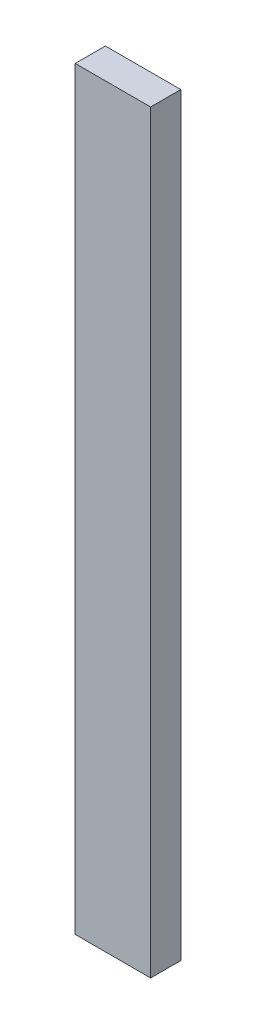
ISO-10303-21;
HEADER;
FILE_DESCRIPTION(('STEP AP214'),'2;1');
FILE_NAME('part.step','',(''),(''),'','','');
FILE_SCHEMA(('AUTOMOTIVE_DESIGN { 1 0 10303 214 1 1 1 1 }'));
ENDSEC;
DATA;
#1=APPLICATION_CONTEXT('core data for automotive mechanical design processes');
#2=APPLICATION_PROTOCOL_DEFINITION('international standard','automotive_design',2000,#1);
#3=PRODUCT_CONTEXT('',#1,'mechanical');
#4=PRODUCT('Part','Part','',(#3));
#5=PRODUCT_RELATED_PRODUCT_CATEGORY('part','',(#4));
#6=PRODUCT_DEFINITION_FORMATION('','',#4);
#7=PRODUCT_DEFINITION_CONTEXT('part definition',#1,'design');
#8=PRODUCT_DEFINITION('design','',#6,#7);
#9=PRODUCT_DEFINITION_SHAPE('','',#8);
#10=(LENGTH_UNIT() NAMED_UNIT(*) SI_UNIT(.MILLI.,.METRE.));
#11=(NAMED_UNIT(*) PLANE_ANGLE_UNIT() SI_UNIT($,.RADIAN.));
#12=(NAMED_UNIT(*) SI_UNIT($,.STERADIAN.) SOLID_ANGLE_UNIT());
#13=UNCERTAINTY_MEASURE_WITH_UNIT(LENGTH_MEASURE(1.E-05),#10,'distance_accuracy_value','');
#14=(GEOMETRIC_REPRESENTATION_CONTEXT(3) GLOBAL_UNCERTAINTY_ASSIGNED_CONTEXT((#13)) GLOBAL_UNIT_ASSIGNED_CONTEXT((#10,
#11,#12)) REPRESENTATION_CONTEXT('',''));
#15=CARTESIAN_POINT('',(0.,0.,0.));
#16=DIRECTION('',(0.,0.,1.));
#17=DIRECTION('',(1.,0.,0.));
#18=AXIS2_PLACEMENT_3D('',#15,#16,#17);
#19=CARTESIAN_POINT('',(2.5,25.,2.));
#20=DIRECTION('',(-1.,0.,0.));
#21=DIRECTION('',(0.,-1.,0.));
#22=AXIS2_PLACEMENT_3D('',#19,#20,#21);
#23=PLANE('',#22);
#24=DIRECTION('',(0.,1.,0.));
#25=VECTOR('',#24,1.);
#26=CARTESIAN_POINT('',(2.5,25.,0.));
#27=LINE('',#26,#25);
#28=CARTESIAN_POINT('',(2.5,-25.,0.));
#29=VERTEX_POINT('',#28);
#30=CARTESIAN_POINT('',(2.5,25.,0.));
#31=VERTEX_POINT('',#30);
#32=EDGE_CURVE('E107',#29,#31,#27,.T.);
#33=ORIENTED_EDGE('',*,*,#32,.T.);
#34=DIRECTION('',(0.,0.,-1.));
#35=VECTOR('',#34,1.);
#36=CARTESIAN_POINT('',(2.5,25.,2.));
#37=LINE('',#36,#35);
#38=CARTESIAN_POINT('',(2.5,25.,2.));
#39=VERTEX_POINT('',#38);
#40=EDGE_CURVE('E11',#39,#31,#37,.T.);
#41=ORIENTED_EDGE('',*,*,#40,.F.);
#42=DIRECTION('',(0.,1.,0.));
#43=VECTOR('',#42,1.);
#44=CARTESIAN_POINT('',(2.5,25.,2.));
#45=LINE('',#44,#43);
#46=CARTESIAN_POINT('',(2.5,-25.,2.));
#47=VERTEX_POINT('',#46);
#48=EDGE_CURVE('E91',#47,#39,#45,.T.);
#49=ORIENTED_EDGE('',*,*,#48,.F.);
#50=DIRECTION('',(0.,0.,-1.));
#51=VECTOR('',#50,1.);
#52=CARTESIAN_POINT('',(2.5,-25.,2.));
#53=LINE('',#52,#51);
#54=EDGE_CURVE('E103',#47,#29,#53,.T.);
#55=ORIENTED_EDGE('',*,*,#54,.T.);
#56=EDGE_LOOP('',(#33,#41,#49,#55));
#57=FACE_BOUND('',#56,.T.);
#58=ADVANCED_FACE('F39',(#57),#23,.F.);
#59=CARTESIAN_POINT('',(-2.5,25.,2.));
#60=DIRECTION('',(0.,-1.,0.));
#61=DIRECTION('',(0.,0.,-1.));
#62=AXIS2_PLACEMENT_3D('',#59,#60,#61);
#63=PLANE('',#62);
#64=DIRECTION('',(-1.,0.,0.));
#65=VECTOR('',#64,1.);
#66=CARTESIAN_POINT('',(-2.5,25.,0.));
#67=LINE('',#66,#65);
#68=CARTESIAN_POINT('',(-2.5,25.,0.));
#69=VERTEX_POINT('',#68);
#70=EDGE_CURVE('E96',#31,#69,#67,.T.);
#71=ORIENTED_EDGE('',*,*,#70,.T.);
#72=DIRECTION('',(0.,0.,-1.));
#73=VECTOR('',#72,1.);
#74=CARTESIAN_POINT('',(-2.5,25.,2.));
#75=LINE('',#74,#73);
#76=CARTESIAN_POINT('',(-2.5,25.,2.));
#77=VERTEX_POINT('',#76);
#78=EDGE_CURVE('E48',#77,#69,#75,.T.);
#79=ORIENTED_EDGE('',*,*,#78,.F.);
#80=DIRECTION('',(-1.,0.,0.));
#81=VECTOR('',#80,1.);
#82=CARTESIAN_POINT('',(-2.5,25.,2.));
#83=LINE('',#82,#81);
#84=EDGE_CURVE('E86',#39,#77,#83,.T.);
#85=ORIENTED_EDGE('',*,*,#84,.F.);
#86=ORIENTED_EDGE('',*,*,#40,.T.);
#87=EDGE_LOOP('',(#71,#79,#85,#86));
#88=FACE_BOUND('',#87,.T.);
#89=ADVANCED_FACE('F95',(#88),#63,.F.);
#90=CARTESIAN_POINT('',(-2.5,25.,2.));
#91=DIRECTION('',(1.,0.,0.));
#92=DIRECTION('',(0.,1.,0.));
#93=AXIS2_PLACEMENT_3D('',#90,#91,#92);
#94=PLANE('',#93);
#95=DIRECTION('',(0.,-1.,0.));
#96=VECTOR('',#95,1.);
#97=CARTESIAN_POINT('',(-2.5,25.,0.));
#98=LINE('',#97,#96);
#99=CARTESIAN_POINT('',(-2.5,-25.,0.));
#100=VERTEX_POINT('',#99);
#101=EDGE_CURVE('E73',#69,#100,#98,.T.);
#102=ORIENTED_EDGE('',*,*,#101,.T.);
#103=DIRECTION('',(0.,0.,-1.));
#104=VECTOR('',#103,1.);
#105=CARTESIAN_POINT('',(-2.5,-25.,2.));
#106=LINE('',#105,#104);
#107=CARTESIAN_POINT('',(-2.5,-25.,2.));
#108=VERTEX_POINT('',#107);
#109=EDGE_CURVE('E98',#108,#100,#106,.T.);
#110=ORIENTED_EDGE('',*,*,#109,.F.);
#111=DIRECTION('',(0.,-1.,0.));
#112=VECTOR('',#111,1.);
#113=CARTESIAN_POINT('',(-2.5,25.,2.));
#114=LINE('',#113,#112);
#115=EDGE_CURVE('E89',#77,#108,#114,.T.);
#116=ORIENTED_EDGE('',*,*,#115,.F.);
#117=ORIENTED_EDGE('',*,*,#78,.T.);
#118=EDGE_LOOP('',(#102,#110,#116,#117));
#119=FACE_BOUND('',#118,.T.);
#120=ADVANCED_FACE('F99',(#119),#94,.F.);
#121=CARTESIAN_POINT('',(-2.5,-25.,2.));
#122=DIRECTION('',(0.,1.,0.));
#123=DIRECTION('',(0.,0.,1.));
#124=AXIS2_PLACEMENT_3D('',#121,#122,#123);
#125=PLANE('',#124);
#126=DIRECTION('',(1.,0.,0.));
#127=VECTOR('',#126,1.);
#128=CARTESIAN_POINT('',(-2.5,-25.,0.));
#129=LINE('',#128,#127);
#130=EDGE_CURVE('E79',#100,#29,#129,.T.);
#131=ORIENTED_EDGE('',*,*,#130,.T.);
#132=ORIENTED_EDGE('',*,*,#54,.F.);
#133=DIRECTION('',(1.,0.,0.));
#134=VECTOR('',#133,1.);
#135=CARTESIAN_POINT('',(-2.5,-25.,2.));
#136=LINE('',#135,#134);
#137=EDGE_CURVE('E56',#108,#47,#136,.T.);
#138=ORIENTED_EDGE('',*,*,#137,.F.);
#139=ORIENTED_EDGE('',*,*,#109,.T.);
#140=EDGE_LOOP('',(#131,#132,#138,#139));
#141=FACE_BOUND('',#140,.T.);
#142=ADVANCED_FACE('F120',(#141),#125,.F.);
#143=CARTESIAN_POINT('',(0.,0.,2.));
#144=DIRECTION('',(0.,0.,1.));
#145=DIRECTION('',(1.,0.,0.));
#146=AXIS2_PLACEMENT_3D('',#143,#144,#145);
#147=PLANE('',#146);
#148=ORIENTED_EDGE('',*,*,#48,.T.);
#149=ORIENTED_EDGE('',*,*,#84,.T.);
#150=ORIENTED_EDGE('',*,*,#115,.T.);
#151=ORIENTED_EDGE('',*,*,#137,.T.);
#152=EDGE_LOOP('',(#148,#149,#150,#151));
#153=FACE_BOUND('',#152,.T.);
#154=ADVANCED_FACE('F87',(#153),#147,.T.);
#155=CARTESIAN_POINT('',(0.,0.,0.));
#156=DIRECTION('',(0.,0.,1.));
#157=DIRECTION('',(1.,0.,0.));
#158=AXIS2_PLACEMENT_3D('',#155,#156,#157);
#159=PLANE('',#158);
#160=ORIENTED_EDGE('',*,*,#32,.F.);
#161=ORIENTED_EDGE('',*,*,#130,.F.);
#162=ORIENTED_EDGE('',*,*,#101,.F.);
#163=ORIENTED_EDGE('',*,*,#70,.F.);
#164=EDGE_LOOP('',(#160,#161,#162,#163));
#165=FACE_BOUND('',#164,.T.);
#166=ADVANCED_FACE('F123',(#165),#159,.F.);
#167=CLOSED_SHELL('',(#58,#89,#120,#142,#154,#166));
#168=MANIFOLD_SOLID_BREP('B2',#167);
#169=ADVANCED_BREP_SHAPE_REPRESENTATION('',(#18,#168),#14);
#170=SHAPE_DEFINITION_REPRESENTATION(#9,#169);
ENDSEC;
END-ISO-10303-21;
